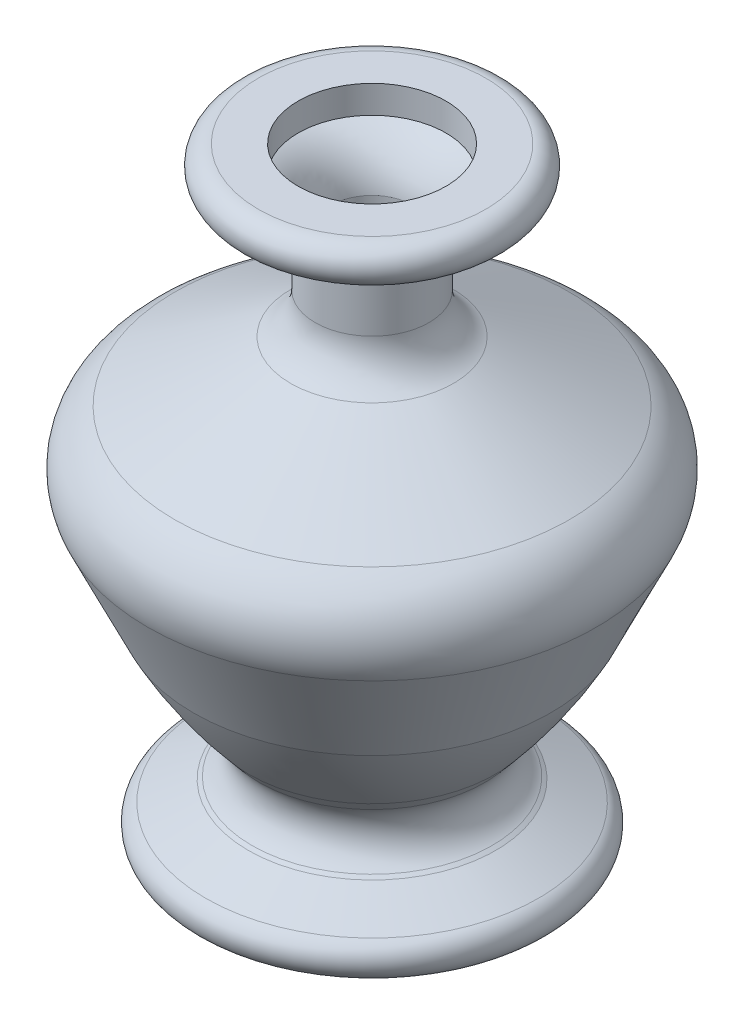
ISO-10303-21;
HEADER;
FILE_DESCRIPTION(('STEP AP214'),'2;1');
FILE_NAME('part.step','',(''),(''),'','','');
FILE_SCHEMA(('AUTOMOTIVE_DESIGN { 1 0 10303 214 1 1 1 1 }'));
ENDSEC;
DATA;
#1=APPLICATION_CONTEXT('core data for automotive mechanical design processes');
#2=APPLICATION_PROTOCOL_DEFINITION('international standard','automotive_design',2000,#1);
#3=PRODUCT_CONTEXT('',#1,'mechanical');
#4=PRODUCT('Part','Part','',(#3));
#5=PRODUCT_RELATED_PRODUCT_CATEGORY('part','',(#4));
#6=PRODUCT_DEFINITION_FORMATION('','',#4);
#7=PRODUCT_DEFINITION_CONTEXT('part definition',#1,'design');
#8=PRODUCT_DEFINITION('design','',#6,#7);
#9=PRODUCT_DEFINITION_SHAPE('','',#8);
#10=(LENGTH_UNIT() NAMED_UNIT(*) SI_UNIT(.MILLI.,.METRE.));
#11=(NAMED_UNIT(*) PLANE_ANGLE_UNIT() SI_UNIT($,.RADIAN.));
#12=(NAMED_UNIT(*) SI_UNIT($,.STERADIAN.) SOLID_ANGLE_UNIT());
#13=UNCERTAINTY_MEASURE_WITH_UNIT(LENGTH_MEASURE(1.E-05),#10,'distance_accuracy_value','');
#14=(GEOMETRIC_REPRESENTATION_CONTEXT(3) GLOBAL_UNCERTAINTY_ASSIGNED_CONTEXT((#13)) GLOBAL_UNIT_ASSIGNED_CONTEXT((#10,
#11,#12)) REPRESENTATION_CONTEXT('',''));
#15=CARTESIAN_POINT('',(0.,0.,0.));
#16=DIRECTION('',(0.,0.,1.));
#17=DIRECTION('',(1.,0.,0.));
#18=AXIS2_PLACEMENT_3D('',#15,#16,#17);
#19=CARTESIAN_POINT('',(-60.0765679059718,144.763199741375,0.));
#20=DIRECTION('',(0.,1.,0.));
#21=DIRECTION('',(0.,0.,1.));
#22=AXIS2_PLACEMENT_3D('',#19,#20,#21);
#23=TOROIDAL_SURFACE('',#22,26.7773438942599,12.);
#24=CARTESIAN_POINT('',(-60.0765679059718,156.763199741375,0.));
#25=DIRECTION('',(0.,1.,0.));
#26=DIRECTION('',(0.,0.,1.));
#27=AXIS2_PLACEMENT_3D('',#24,#25,#26);
#28=CIRCLE('',#27,26.7773438942599);
#29=CARTESIAN_POINT('',(-60.0765679059718,156.763199741375,26.7773438942599));
#30=VERTEX_POINT('',#29);
#31=EDGE_CURVE('E126',#30,#30,#28,.T.);
#32=ORIENTED_EDGE('',*,*,#31,.F.);
#33=EDGE_LOOP('',(#32));
#34=FACE_BOUND('',#33,.T.);
#35=CARTESIAN_POINT('',(-60.0765679059718,147.064106257585,0.));
#36=DIRECTION('',(0.,1.,0.));
#37=DIRECTION('',(0.,0.,1.));
#38=AXIS2_PLACEMENT_3D('',#35,#36,#37);
#39=CIRCLE('',#38,15.);
#40=CARTESIAN_POINT('',(-60.0765679059718,147.064106257585,15.));
#41=VERTEX_POINT('',#40);
#42=EDGE_CURVE('E10',#41,#41,#39,.T.);
#43=ORIENTED_EDGE('',*,*,#42,.T.);
#44=EDGE_LOOP('',(#43));
#45=FACE_BOUND('',#44,.T.);
#46=ADVANCED_FACE('F35',(#34,#45),#23,.F.);
#47=CARTESIAN_POINT('',(-60.0765679059718,168.729058273268,0.));
#48=DIRECTION('',(0.,1.,0.));
#49=DIRECTION('',(0.,0.,1.));
#50=AXIS2_PLACEMENT_3D('',#47,#48,#49);
#51=CYLINDRICAL_SURFACE('',#50,15.);
#52=CARTESIAN_POINT('',(-60.0765679059718,133.364106257585,0.));
#53=DIRECTION('',(0.,1.,0.));
#54=DIRECTION('',(0.,0.,1.));
#55=AXIS2_PLACEMENT_3D('',#52,#53,#54);
#56=CIRCLE('',#55,15.);
#57=CARTESIAN_POINT('',(-60.0765679059718,133.364106257585,15.));
#58=VERTEX_POINT('',#57);
#59=EDGE_CURVE('E41',#58,#58,#56,.T.);
#60=ORIENTED_EDGE('',*,*,#59,.T.);
#61=EDGE_LOOP('',(#60));
#62=FACE_BOUND('',#61,.T.);
#63=ORIENTED_EDGE('',*,*,#42,.F.);
#64=EDGE_LOOP('',(#63));
#65=FACE_BOUND('',#64,.T.);
#66=ADVANCED_FACE('F133',(#62,#65),#51,.T.);
#67=CARTESIAN_POINT('',(-60.0765679059718,133.364106257585,0.));
#68=DIRECTION('',(0.,1.,0.));
#69=DIRECTION('',(0.,0.,1.));
#70=AXIS2_PLACEMENT_3D('',#67,#68,#69);
#71=TOROIDAL_SURFACE('',#70,27.,12.0000000000001);
#72=CARTESIAN_POINT('',(-60.0765679059718,122.711419863062,0.));
#73=DIRECTION('',(0.,1.,0.));
#74=DIRECTION('',(0.,0.,1.));
#75=AXIS2_PLACEMENT_3D('',#72,#73,#74);
#76=CIRCLE('',#75,21.475484403139);
#77=CARTESIAN_POINT('',(-60.0765679059718,122.711419863062,21.475484403139));
#78=VERTEX_POINT('',#77);
#79=EDGE_CURVE('E45',#78,#78,#76,.T.);
#80=ORIENTED_EDGE('',*,*,#79,.T.);
#81=EDGE_LOOP('',(#80));
#82=FACE_BOUND('',#81,.T.);
#83=ORIENTED_EDGE('',*,*,#59,.F.);
#84=EDGE_LOOP('',(#83));
#85=FACE_BOUND('',#84,.T.);
#86=ADVANCED_FACE('F137',(#82,#85),#71,.F.);
#87=CARTESIAN_POINT('',(-60.0765679059718,122.711419863062,0.));
#88=DIRECTION('',(0.,-1.,0.));
#89=DIRECTION('',(0.,0.,-1.));
#90=AXIS2_PLACEMENT_3D('',#87,#88,#89);
#91=CONICAL_SURFACE('',#90,21.475484403139,1.09237728206462);
#92=CARTESIAN_POINT('',(-60.0765679059718,106.855347916404,0.));
#93=DIRECTION('',(0.,1.,0.));
#94=DIRECTION('',(0.,0.,1.));
#95=AXIS2_PLACEMENT_3D('',#92,#93,#94);
#96=CIRCLE('',#95,52.0500676286264);
#97=CARTESIAN_POINT('',(-60.0765679059718,106.855347916404,52.0500676286264));
#98=VERTEX_POINT('',#97);
#99=EDGE_CURVE('E49',#98,#98,#96,.T.);
#100=ORIENTED_EDGE('',*,*,#99,.T.);
#101=EDGE_LOOP('',(#100));
#102=FACE_BOUND('',#101,.T.);
#103=ORIENTED_EDGE('',*,*,#79,.F.);
#104=EDGE_LOOP('',(#103));
#105=FACE_BOUND('',#104,.T.);
#106=ADVANCED_FACE('F141',(#102,#105),#91,.T.);
#107=CARTESIAN_POINT('',(-60.0765679059718,92.6517660570412,0.));
#108=DIRECTION('',(0.,1.,0.));
#109=DIRECTION('',(0.,0.,1.));
#110=AXIS2_PLACEMENT_3D('',#107,#108,#109);
#111=TOROIDAL_SURFACE('',#110,44.6840468328117,16.);
#112=ORIENTED_EDGE('',*,*,#99,.F.);
#113=EDGE_LOOP('',(#112));
#114=FACE_BOUND('',#113,.T.);
#115=CARTESIAN_POINT('',(-60.0765679059718,85.8324017523891,0.));
#116=DIRECTION('',(0.,1.,0.));
#117=DIRECTION('',(0.,0.,1.));
#118=AXIS2_PLACEMENT_3D('',#115,#116,#117);
#119=CIRCLE('',#118,59.1580328242529);
#120=CARTESIAN_POINT('',(-60.0765679059718,85.8324017523891,59.1580328242529));
#121=VERTEX_POINT('',#120);
#122=EDGE_CURVE('E54',#121,#121,#119,.T.);
#123=ORIENTED_EDGE('',*,*,#122,.T.);
#124=EDGE_LOOP('',(#123));
#125=FACE_BOUND('',#124,.T.);
#126=ADVANCED_FACE('F148',(#114,#125),#111,.T.);
#127=CARTESIAN_POINT('',(-60.0765679059718,60.2250987462849,0.));
#128=DIRECTION('',(0.,1.,0.));
#129=DIRECTION('',(0.,0.,1.));
#130=AXIS2_PLACEMENT_3D('',#127,#128,#129);
#131=CONICAL_SURFACE('',#130,47.0932478948286,0.440299334140072);
#132=ORIENTED_EDGE('',*,*,#122,.F.);
#133=EDGE_LOOP('',(#132));
#134=FACE_BOUND('',#133,.T.);
#135=CARTESIAN_POINT('',(-60.0765679059718,60.2250987462849,0.));
#136=DIRECTION('',(0.,1.,0.));
#137=DIRECTION('',(0.,0.,1.));
#138=AXIS2_PLACEMENT_3D('',#135,#136,#137);
#139=CIRCLE('',#138,47.0932478948286);
#140=CARTESIAN_POINT('',(-60.0765679059718,60.2250987462849,47.0932478948286));
#141=VERTEX_POINT('',#140);
#142=EDGE_CURVE('E57',#141,#141,#139,.T.);
#143=ORIENTED_EDGE('',*,*,#142,.T.);
#144=EDGE_LOOP('',(#143));
#145=FACE_BOUND('',#144,.T.);
#146=ADVANCED_FACE('F152',(#134,#145),#131,.T.);
#147=CARTESIAN_POINT('',(-60.0765679059718,119.686273789408,0.));
#148=DIRECTION('',(0.,1.,0.));
#149=DIRECTION('',(0.,0.,1.));
#150=AXIS2_PLACEMENT_3D('',#147,#148,#149);
#151=DEGENERATE_TOROIDAL_SURFACE('',#150,62.6309912799823,124.8,.F.);
#152=CARTESIAN_POINT('',(-60.0765679059718,38.9100400277715,0.));
#153=DIRECTION('',(0.,1.,0.));
#154=DIRECTION('',(0.,0.,1.));
#155=AXIS2_PLACEMENT_3D('',#152,#153,#154);
#156=CIRCLE('',#155,32.5017583874457);
#157=CARTESIAN_POINT('',(-60.0765679059718,38.9100400277715,32.5017583874457));
#158=VERTEX_POINT('',#157);
#159=EDGE_CURVE('E60',#158,#158,#156,.T.);
#160=ORIENTED_EDGE('',*,*,#159,.T.);
#161=EDGE_LOOP('',(#160));
#162=FACE_BOUND('',#161,.T.);
#163=ORIENTED_EDGE('',*,*,#142,.F.);
#164=EDGE_LOOP('',(#163));
#165=FACE_BOUND('',#164,.T.);
#166=ADVANCED_FACE('F156',(#162,#165),#151,.F.);
#167=CARTESIAN_POINT('',(-60.0765679059718,38.9100400277715,0.));
#168=DIRECTION('',(0.,1.,0.));
#169=DIRECTION('',(0.,0.,1.));
#170=AXIS2_PLACEMENT_3D('',#167,#168,#169);
#171=CONICAL_SURFACE('',#170,32.5017583874457,0.703965325612332);
#172=CARTESIAN_POINT('',(-60.0765679059718,35.6021515100554,0.));
#173=DIRECTION('',(0.,1.,0.));
#174=DIRECTION('',(0.,0.,1.));
#175=AXIS2_PLACEMENT_3D('',#172,#173,#174);
#176=CIRCLE('',#175,29.6930644613418);
#177=CARTESIAN_POINT('',(-60.0765679059718,35.6021515100554,29.6930644613418));
#178=VERTEX_POINT('',#177);
#179=EDGE_CURVE('E63',#178,#178,#176,.T.);
#180=ORIENTED_EDGE('',*,*,#179,.T.);
#181=EDGE_LOOP('',(#180));
#182=FACE_BOUND('',#181,.T.);
#183=ORIENTED_EDGE('',*,*,#159,.F.);
#184=EDGE_LOOP('',(#183));
#185=FACE_BOUND('',#184,.T.);
#186=ADVANCED_FACE('F160',(#182,#185),#171,.T.);
#187=CARTESIAN_POINT('',(-60.0765679059718,29.7769423445542,0.));
#188=DIRECTION('',(0.,1.,0.));
#189=DIRECTION('',(0.,0.,1.));
#190=AXIS2_PLACEMENT_3D('',#187,#188,#189);
#191=TOROIDAL_SURFACE('',#190,36.5535992931258,8.99999999999777);
#192=CARTESIAN_POINT('',(-60.0765679059718,22.2185457265492,0.));
#193=DIRECTION('',(0.,1.,0.));
#194=DIRECTION('',(0.,0.,1.));
#195=AXIS2_PLACEMENT_3D('',#192,#193,#194);
#196=CIRCLE('',#195,31.6678403382764);
#197=CARTESIAN_POINT('',(-60.0765679059718,22.2185457265492,31.6678403382764));
#198=VERTEX_POINT('',#197);
#199=EDGE_CURVE('E66',#198,#198,#196,.T.);
#200=ORIENTED_EDGE('',*,*,#199,.T.);
#201=EDGE_LOOP('',(#200));
#202=FACE_BOUND('',#201,.T.);
#203=ORIENTED_EDGE('',*,*,#179,.F.);
#204=EDGE_LOOP('',(#203));
#205=FACE_BOUND('',#204,.T.);
#206=ADVANCED_FACE('F164',(#202,#205),#191,.F.);
#207=CARTESIAN_POINT('',(-60.0765679059718,22.2185457265492,0.));
#208=DIRECTION('',(0.,-1.,0.));
#209=DIRECTION('',(0.,0.,-1.));
#210=AXIS2_PLACEMENT_3D('',#207,#208,#209);
#211=CONICAL_SURFACE('',#210,31.6678403382764,0.996954964416852);
#212=CARTESIAN_POINT('',(-60.0765679059718,21.5894611194127,0.));
#213=DIRECTION('',(0.,1.,0.));
#214=DIRECTION('',(0.,0.,1.));
#215=AXIS2_PLACEMENT_3D('',#212,#213,#214);
#216=CIRCLE('',#215,32.6410506441799);
#217=CARTESIAN_POINT('',(-60.0765679059718,21.5894611194127,32.6410506441799));
#218=VERTEX_POINT('',#217);
#219=EDGE_CURVE('E69',#218,#218,#216,.T.);
#220=ORIENTED_EDGE('',*,*,#219,.T.);
#221=EDGE_LOOP('',(#220));
#222=FACE_BOUND('',#221,.T.);
#223=ORIENTED_EDGE('',*,*,#199,.F.);
#224=EDGE_LOOP('',(#223));
#225=FACE_BOUND('',#224,.T.);
#226=ADVANCED_FACE('F168',(#222,#225),#211,.T.);
#227=CARTESIAN_POINT('',(-60.0765679059718,16.2863203636992,0.));
#228=DIRECTION('',(0.,-1.,0.));
#229=DIRECTION('',(0.,0.,-1.));
#230=AXIS2_PLACEMENT_3D('',#227,#228,#229);
#231=CONICAL_SURFACE('',#230,43.8968776655454,1.13049699265483);
#232=ORIENTED_EDGE('',*,*,#219,.F.);
#233=EDGE_LOOP('',(#232));
#234=FACE_BOUND('',#233,.T.);
#235=CARTESIAN_POINT('',(-60.0765679059718,16.2863203636992,0.));
#236=DIRECTION('',(0.,1.,0.));
#237=DIRECTION('',(0.,0.,1.));
#238=AXIS2_PLACEMENT_3D('',#235,#236,#237);
#239=CIRCLE('',#238,43.8968776655454);
#240=CARTESIAN_POINT('',(-60.0765679059718,16.2863203636992,43.8968776655454));
#241=VERTEX_POINT('',#240);
#242=EDGE_CURVE('E72',#241,#241,#239,.T.);
#243=ORIENTED_EDGE('',*,*,#242,.T.);
#244=EDGE_LOOP('',(#243));
#245=FACE_BOUND('',#244,.T.);
#246=ADVANCED_FACE('F172',(#234,#245),#231,.T.);
#247=CARTESIAN_POINT('',(-60.0765679059718,11.763199741374,0.));
#248=DIRECTION('',(0.,1.,0.));
#249=DIRECTION('',(0.,0.,1.));
#250=AXIS2_PLACEMENT_3D('',#247,#248,#249);
#251=TOROIDAL_SURFACE('',#250,41.7658263203418,4.99999999999973);
#252=ORIENTED_EDGE('',*,*,#242,.F.);
#253=EDGE_LOOP('',(#252));
#254=FACE_BOUND('',#253,.T.);
#255=CARTESIAN_POINT('',(-60.0765679059718,6.76319974137432,0.));
#256=DIRECTION('',(0.,1.,0.));
#257=DIRECTION('',(0.,0.,1.));
#258=AXIS2_PLACEMENT_3D('',#255,#256,#257);
#259=CIRCLE('',#258,41.7658263203418);
#260=CARTESIAN_POINT('',(-60.0765679059718,6.76319974137432,41.7658263203418));
#261=VERTEX_POINT('',#260);
#262=EDGE_CURVE('E75',#261,#261,#259,.T.);
#263=ORIENTED_EDGE('',*,*,#262,.T.);
#264=EDGE_LOOP('',(#263));
#265=FACE_BOUND('',#264,.T.);
#266=ADVANCED_FACE('F176',(#254,#265),#251,.T.);
#267=CARTESIAN_POINT('',(0.,6.76319974137431,0.));
#268=DIRECTION('',(0.,1.,0.));
#269=DIRECTION('',(0.,0.,1.));
#270=AXIS2_PLACEMENT_3D('',#267,#268,#269);
#271=PLANE('',#270);
#272=ORIENTED_EDGE('',*,*,#262,.F.);
#273=EDGE_LOOP('',(#272));
#274=FACE_BOUND('',#273,.T.);
#275=ADVANCED_FACE('F180',(#274),#271,.F.);
#276=CARTESIAN_POINT('',(0.,11.1631997413743,0.));
#277=DIRECTION('',(0.,-1.,0.));
#278=DIRECTION('',(0.,0.,-1.));
#279=AXIS2_PLACEMENT_3D('',#276,#277,#278);
#280=PLANE('',#279);
#281=CARTESIAN_POINT('',(-60.0765679059718,11.1631997413743,0.));
#282=DIRECTION('',(0.,1.,0.));
#283=DIRECTION('',(0.,0.,1.));
#284=AXIS2_PLACEMENT_3D('',#281,#282,#283);
#285=CIRCLE('',#284,41.7658263203418);
#286=CARTESIAN_POINT('',(-60.0765679059718,11.1631997413743,41.7658263203418));
#287=VERTEX_POINT('',#286);
#288=EDGE_CURVE('E78',#287,#287,#285,.T.);
#289=ORIENTED_EDGE('',*,*,#288,.T.);
#290=EDGE_LOOP('',(#289));
#291=FACE_BOUND('',#290,.T.);
#292=ADVANCED_FACE('F184',(#291),#280,.F.);
#293=CARTESIAN_POINT('',(-60.0765679059718,11.763199741374,0.));
#294=DIRECTION('',(0.,1.,0.));
#295=DIRECTION('',(0.,0.,1.));
#296=AXIS2_PLACEMENT_3D('',#293,#294,#295);
#297=TOROIDAL_SURFACE('',#296,41.7658263203418,0.599999999999732);
#298=CARTESIAN_POINT('',(-60.0765679059718,12.3059742160528,0.));
#299=DIRECTION('',(0.,1.,0.));
#300=DIRECTION('',(0.,0.,1.));
#301=AXIS2_PLACEMENT_3D('',#298,#299,#300);
#302=CIRCLE('',#301,42.0215524817661);
#303=CARTESIAN_POINT('',(-60.0765679059718,12.3059742160528,42.0215524817661));
#304=VERTEX_POINT('',#303);
#305=EDGE_CURVE('E81',#304,#304,#302,.T.);
#306=ORIENTED_EDGE('',*,*,#305,.T.);
#307=EDGE_LOOP('',(#306));
#308=FACE_BOUND('',#307,.T.);
#309=ORIENTED_EDGE('',*,*,#288,.F.);
#310=EDGE_LOOP('',(#309));
#311=FACE_BOUND('',#310,.T.);
#312=ADVANCED_FACE('F188',(#308,#311),#297,.F.);
#313=CARTESIAN_POINT('',(-60.0765679059718,12.3059742160528,0.));
#314=DIRECTION('',(0.,-1.,0.));
#315=DIRECTION('',(0.,0.,-1.));
#316=AXIS2_PLACEMENT_3D('',#313,#314,#315);
#317=CONICAL_SURFACE('',#316,42.0215524817661,1.13049699265482);
#318=CARTESIAN_POINT('',(-60.0765679059718,17.7345187569274,0.));
#319=DIRECTION('',(0.,1.,0.));
#320=DIRECTION('',(0.,0.,1.));
#321=AXIS2_PLACEMENT_3D('',#318,#319,#320);
#322=CIRCLE('',#321,30.4995580364875);
#323=CARTESIAN_POINT('',(-60.0765679059718,17.7345187569274,30.4995580364875));
#324=VERTEX_POINT('',#323);
#325=EDGE_CURVE('E84',#324,#324,#322,.T.);
#326=ORIENTED_EDGE('',*,*,#325,.T.);
#327=EDGE_LOOP('',(#326));
#328=FACE_BOUND('',#327,.T.);
#329=ORIENTED_EDGE('',*,*,#305,.F.);
#330=EDGE_LOOP('',(#329));
#331=FACE_BOUND('',#330,.T.);
#332=ADVANCED_FACE('F192',(#328,#331),#317,.F.);
#333=CARTESIAN_POINT('',(-60.0765679059718,18.5233296021903,0.));
#334=DIRECTION('',(0.,-1.,0.));
#335=DIRECTION('',(0.,0.,-1.));
#336=AXIS2_PLACEMENT_3D('',#333,#334,#335);
#337=CONICAL_SURFACE('',#336,29.2792470714607,0.996954964416839);
#338=ORIENTED_EDGE('',*,*,#325,.F.);
#339=EDGE_LOOP('',(#338));
#340=FACE_BOUND('',#339,.T.);
#341=CARTESIAN_POINT('',(-60.0765679059718,18.5233296021903,0.));
#342=DIRECTION('',(0.,1.,0.));
#343=DIRECTION('',(0.,0.,1.));
#344=AXIS2_PLACEMENT_3D('',#341,#342,#343);
#345=CIRCLE('',#344,29.2792470714607);
#346=CARTESIAN_POINT('',(-60.0765679059718,18.5233296021903,29.2792470714607));
#347=VERTEX_POINT('',#346);
#348=EDGE_CURVE('E87',#347,#347,#345,.T.);
#349=ORIENTED_EDGE('',*,*,#348,.T.);
#350=EDGE_LOOP('',(#349));
#351=FACE_BOUND('',#350,.T.);
#352=ADVANCED_FACE('F196',(#340,#351),#337,.F.);
#353=CARTESIAN_POINT('',(-60.0765679059718,29.7769423445542,0.));
#354=DIRECTION('',(0.,1.,0.));
#355=DIRECTION('',(0.,0.,1.));
#356=AXIS2_PLACEMENT_3D('',#353,#354,#355);
#357=TOROIDAL_SURFACE('',#356,36.5535992931258,13.3999999999978);
#358=ORIENTED_EDGE('',*,*,#348,.F.);
#359=EDGE_LOOP('',(#358));
#360=FACE_BOUND('',#359,.T.);
#361=CARTESIAN_POINT('',(-60.0765679059718,38.4500315465233,0.));
#362=DIRECTION('',(0.,1.,0.));
#363=DIRECTION('',(0.,0.,1.));
#364=AXIS2_PLACEMENT_3D('',#361,#362,#363);
#365=CIRCLE('',#364,26.3390252102466);
#366=CARTESIAN_POINT('',(-60.0765679059718,38.4500315465233,26.3390252102466));
#367=VERTEX_POINT('',#366);
#368=EDGE_CURVE('E90',#367,#367,#365,.T.);
#369=ORIENTED_EDGE('',*,*,#368,.T.);
#370=EDGE_LOOP('',(#369));
#371=FACE_BOUND('',#370,.T.);
#372=ADVANCED_FACE('F200',(#360,#371),#357,.T.);
#373=CARTESIAN_POINT('',(-60.0765679059718,41.7579200642392,0.));
#374=DIRECTION('',(0.,1.,0.));
#375=DIRECTION('',(0.,0.,1.));
#376=AXIS2_PLACEMENT_3D('',#373,#374,#375);
#377=CONICAL_SURFACE('',#376,29.1477191363503,0.703965325612332);
#378=ORIENTED_EDGE('',*,*,#368,.F.);
#379=EDGE_LOOP('',(#378));
#380=FACE_BOUND('',#379,.T.);
#381=CARTESIAN_POINT('',(-60.0765679059718,41.7579200642392,0.));
#382=DIRECTION('',(0.,1.,0.));
#383=DIRECTION('',(0.,0.,1.));
#384=AXIS2_PLACEMENT_3D('',#381,#382,#383);
#385=CIRCLE('',#384,29.1477191363503);
#386=CARTESIAN_POINT('',(-60.0765679059718,41.7579200642392,29.1477191363503));
#387=VERTEX_POINT('',#386);
#388=EDGE_CURVE('E93',#387,#387,#385,.T.);
#389=ORIENTED_EDGE('',*,*,#388,.T.);
#390=EDGE_LOOP('',(#389));
#391=FACE_BOUND('',#390,.T.);
#392=ADVANCED_FACE('F204',(#380,#391),#377,.F.);
#393=CARTESIAN_POINT('',(-60.0765679059718,119.686273789408,0.));
#394=DIRECTION('',(0.,1.,0.));
#395=DIRECTION('',(0.,0.,1.));
#396=AXIS2_PLACEMENT_3D('',#393,#394,#395);
#397=DEGENERATE_TOROIDAL_SURFACE('',#396,62.6309912799823,120.4,.F.);
#398=ORIENTED_EDGE('',*,*,#388,.F.);
#399=EDGE_LOOP('',(#398));
#400=FACE_BOUND('',#399,.T.);
#401=CARTESIAN_POINT('',(-60.0765679059718,62.2135371887155,0.));
#402=DIRECTION('',(0.,1.,0.));
#403=DIRECTION('',(0.,0.,1.));
#404=AXIS2_PLACEMENT_3D('',#401,#402,#403);
#405=CIRCLE('',#404,43.1661946354638);
#406=CARTESIAN_POINT('',(-60.0765679059718,62.2135371887155,43.1661946354638));
#407=VERTEX_POINT('',#406);
#408=EDGE_CURVE('E96',#407,#407,#405,.T.);
#409=ORIENTED_EDGE('',*,*,#408,.T.);
#410=EDGE_LOOP('',(#409));
#411=FACE_BOUND('',#410,.T.);
#412=ADVANCED_FACE('F208',(#400,#411),#397,.T.);
#413=CARTESIAN_POINT('',(-60.0765679059718,62.2135371887155,0.));
#414=DIRECTION('',(0.,1.,0.));
#415=DIRECTION('',(0.,0.,1.));
#416=AXIS2_PLACEMENT_3D('',#413,#414,#415);
#417=CONICAL_SURFACE('',#416,43.1661946354638,0.440299334140071);
#418=CARTESIAN_POINT('',(-60.0765679059718,87.7077269361683,0.));
#419=DIRECTION('',(0.,1.,0.));
#420=DIRECTION('',(0.,0.,1.));
#421=AXIS2_PLACEMENT_3D('',#418,#419,#420);
#422=CIRCLE('',#421,55.1776866766066);
#423=CARTESIAN_POINT('',(-60.0765679059718,87.7077269361683,55.1776866766066));
#424=VERTEX_POINT('',#423);
#425=EDGE_CURVE('E99',#424,#424,#422,.T.);
#426=ORIENTED_EDGE('',*,*,#425,.T.);
#427=EDGE_LOOP('',(#426));
#428=FACE_BOUND('',#427,.T.);
#429=ORIENTED_EDGE('',*,*,#408,.F.);
#430=EDGE_LOOP('',(#429));
#431=FACE_BOUND('',#430,.T.);
#432=ADVANCED_FACE('F212',(#428,#431),#417,.F.);
#433=CARTESIAN_POINT('',(-60.0765679059718,92.6517660570412,0.));
#434=DIRECTION('',(0.,1.,0.));
#435=DIRECTION('',(0.,0.,1.));
#436=AXIS2_PLACEMENT_3D('',#433,#434,#435);
#437=TOROIDAL_SURFACE('',#436,44.6840468328117,11.6);
#438=CARTESIAN_POINT('',(-60.0765679059718,102.949362905079,0.));
#439=DIRECTION('',(0.,1.,0.));
#440=DIRECTION('',(0.,0.,1.));
#441=AXIS2_PLACEMENT_3D('',#438,#439,#440);
#442=CIRCLE('',#441,50.0244119097773);
#443=CARTESIAN_POINT('',(-60.0765679059718,102.949362905079,50.0244119097773));
#444=VERTEX_POINT('',#443);
#445=EDGE_CURVE('E102',#444,#444,#442,.T.);
#446=ORIENTED_EDGE('',*,*,#445,.T.);
#447=EDGE_LOOP('',(#446));
#448=FACE_BOUND('',#447,.T.);
#449=ORIENTED_EDGE('',*,*,#425,.F.);
#450=EDGE_LOOP('',(#449));
#451=FACE_BOUND('',#450,.T.);
#452=ADVANCED_FACE('F216',(#448,#451),#437,.F.);
#453=CARTESIAN_POINT('',(-60.0765679059718,118.805434851737,0.));
#454=DIRECTION('',(0.,-1.,0.));
#455=DIRECTION('',(0.,0.,-1.));
#456=AXIS2_PLACEMENT_3D('',#453,#454,#455);
#457=CONICAL_SURFACE('',#456,19.44982868429,1.09237728206462);
#458=ORIENTED_EDGE('',*,*,#445,.F.);
#459=EDGE_LOOP('',(#458));
#460=FACE_BOUND('',#459,.T.);
#461=CARTESIAN_POINT('',(-60.0765679059718,118.805434851737,0.));
#462=DIRECTION('',(0.,1.,0.));
#463=DIRECTION('',(0.,0.,1.));
#464=AXIS2_PLACEMENT_3D('',#461,#462,#463);
#465=CIRCLE('',#464,19.44982868429);
#466=CARTESIAN_POINT('',(-60.0765679059718,118.805434851737,19.44982868429));
#467=VERTEX_POINT('',#466);
#468=EDGE_CURVE('E105',#467,#467,#465,.T.);
#469=ORIENTED_EDGE('',*,*,#468,.T.);
#470=EDGE_LOOP('',(#469));
#471=FACE_BOUND('',#470,.T.);
#472=ADVANCED_FACE('F220',(#460,#471),#457,.F.);
#473=CARTESIAN_POINT('',(-60.0765679059718,133.364106257585,0.));
#474=DIRECTION('',(0.,1.,0.));
#475=DIRECTION('',(0.,0.,1.));
#476=AXIS2_PLACEMENT_3D('',#473,#474,#475);
#477=TOROIDAL_SURFACE('',#476,27.,16.4000000000002);
#478=ORIENTED_EDGE('',*,*,#468,.F.);
#479=EDGE_LOOP('',(#478));
#480=FACE_BOUND('',#479,.T.);
#481=CARTESIAN_POINT('',(-60.0765679059718,133.364106257585,0.));
#482=DIRECTION('',(0.,1.,0.));
#483=DIRECTION('',(0.,0.,1.));
#484=AXIS2_PLACEMENT_3D('',#481,#482,#483);
#485=CIRCLE('',#484,10.5999999999999);
#486=CARTESIAN_POINT('',(-60.0765679059718,133.364106257585,10.5999999999999));
#487=VERTEX_POINT('',#486);
#488=EDGE_CURVE('E108',#487,#487,#485,.T.);
#489=ORIENTED_EDGE('',*,*,#488,.T.);
#490=EDGE_LOOP('',(#489));
#491=FACE_BOUND('',#490,.T.);
#492=ADVANCED_FACE('F224',(#480,#491),#477,.T.);
#493=CARTESIAN_POINT('',(-60.0765679059718,168.729058273268,0.));
#494=DIRECTION('',(0.,1.,0.));
#495=DIRECTION('',(0.,0.,1.));
#496=AXIS2_PLACEMENT_3D('',#493,#494,#495);
#497=CYLINDRICAL_SURFACE('',#496,10.6);
#498=ORIENTED_EDGE('',*,*,#488,.F.);
#499=EDGE_LOOP('',(#498));
#500=FACE_BOUND('',#499,.T.);
#501=CARTESIAN_POINT('',(-60.0765679059718,147.456440266625,0.));
#502=DIRECTION('',(0.,1.,0.));
#503=DIRECTION('',(0.,0.,1.));
#504=AXIS2_PLACEMENT_3D('',#501,#502,#503);
#505=CIRCLE('',#504,10.6);
#506=CARTESIAN_POINT('',(-60.0765679059718,147.456440266625,10.6));
#507=VERTEX_POINT('',#506);
#508=EDGE_CURVE('E111',#507,#507,#505,.T.);
#509=ORIENTED_EDGE('',*,*,#508,.T.);
#510=EDGE_LOOP('',(#509));
#511=FACE_BOUND('',#510,.T.);
#512=ADVANCED_FACE('F228',(#500,#511),#497,.F.);
#513=CARTESIAN_POINT('',(-60.0765679059718,144.763199741375,0.));
#514=DIRECTION('',(0.,1.,0.));
#515=DIRECTION('',(0.,0.,1.));
#516=AXIS2_PLACEMENT_3D('',#513,#514,#515);
#517=TOROIDAL_SURFACE('',#516,26.7773438942599,16.4);
#518=CARTESIAN_POINT('',(-60.0765679059718,159.46014724229,0.));
#519=DIRECTION('',(0.,1.,0.));
#520=DIRECTION('',(0.,0.,1.));
#521=AXIS2_PLACEMENT_3D('',#518,#519,#520);
#522=CIRCLE('',#521,19.5);
#523=CARTESIAN_POINT('',(-60.0765679059718,159.46014724229,19.5));
#524=VERTEX_POINT('',#523);
#525=EDGE_CURVE('E114',#524,#524,#522,.T.);
#526=ORIENTED_EDGE('',*,*,#525,.T.);
#527=EDGE_LOOP('',(#526));
#528=FACE_BOUND('',#527,.T.);
#529=ORIENTED_EDGE('',*,*,#508,.F.);
#530=EDGE_LOOP('',(#529));
#531=FACE_BOUND('',#530,.T.);
#532=ADVANCED_FACE('F232',(#528,#531),#517,.T.);
#533=CARTESIAN_POINT('',(-60.0765679059718,168.729058273268,0.));
#534=DIRECTION('',(0.,1.,0.));
#535=DIRECTION('',(0.,0.,1.));
#536=AXIS2_PLACEMENT_3D('',#533,#534,#535);
#537=CYLINDRICAL_SURFACE('',#536,19.5);
#538=CARTESIAN_POINT('',(-60.0765679059718,166.763199741375,0.));
#539=DIRECTION('',(0.,1.,0.));
#540=DIRECTION('',(0.,0.,1.));
#541=AXIS2_PLACEMENT_3D('',#538,#539,#540);
#542=CIRCLE('',#541,19.5);
#543=CARTESIAN_POINT('',(-60.0765679059718,166.763199741375,19.5));
#544=VERTEX_POINT('',#543);
#545=EDGE_CURVE('E117',#544,#544,#542,.T.);
#546=ORIENTED_EDGE('',*,*,#545,.T.);
#547=EDGE_LOOP('',(#546));
#548=FACE_BOUND('',#547,.T.);
#549=ORIENTED_EDGE('',*,*,#525,.F.);
#550=EDGE_LOOP('',(#549));
#551=FACE_BOUND('',#550,.T.);
#552=ADVANCED_FACE('F236',(#548,#551),#537,.F.);
#553=CARTESIAN_POINT('',(-4.4081986669771E-13,166.763199741374,0.));
#554=DIRECTION('',(0.,-1.,0.));
#555=DIRECTION('',(0.,0.,-1.));
#556=AXIS2_PLACEMENT_3D('',#553,#554,#555);
#557=PLANE('',#556);
#558=ORIENTED_EDGE('',*,*,#545,.F.);
#559=EDGE_LOOP('',(#558));
#560=FACE_BOUND('',#559,.T.);
#561=CARTESIAN_POINT('',(-60.0765679059718,166.763199741374,0.));
#562=DIRECTION('',(0.,1.,0.));
#563=DIRECTION('',(0.,0.,1.));
#564=AXIS2_PLACEMENT_3D('',#561,#562,#563);
#565=CIRCLE('',#564,30.);
#566=CARTESIAN_POINT('',(-60.0765679059718,166.763199741374,30.));
#567=VERTEX_POINT('',#566);
#568=EDGE_CURVE('E120',#567,#567,#565,.T.);
#569=ORIENTED_EDGE('',*,*,#568,.T.);
#570=EDGE_LOOP('',(#569));
#571=FACE_BOUND('',#570,.T.);
#572=ADVANCED_FACE('F240',(#560,#571),#557,.F.);
#573=CARTESIAN_POINT('',(-60.0765679059718,161.763199741375,0.));
#574=DIRECTION('',(0.,1.,0.));
#575=DIRECTION('',(0.,0.,1.));
#576=AXIS2_PLACEMENT_3D('',#573,#574,#575);
#577=TOROIDAL_SURFACE('',#576,30.,4.99999999999995);
#578=CARTESIAN_POINT('',(-60.0765679059718,156.763199741375,0.));
#579=DIRECTION('',(0.,1.,0.));
#580=DIRECTION('',(0.,0.,1.));
#581=AXIS2_PLACEMENT_3D('',#578,#579,#580);
#582=CIRCLE('',#581,30.);
#583=CARTESIAN_POINT('',(-60.0765679059718,156.763199741375,30.));
#584=VERTEX_POINT('',#583);
#585=EDGE_CURVE('E123',#584,#584,#582,.T.);
#586=ORIENTED_EDGE('',*,*,#585,.T.);
#587=EDGE_LOOP('',(#586));
#588=FACE_BOUND('',#587,.T.);
#589=ORIENTED_EDGE('',*,*,#568,.F.);
#590=EDGE_LOOP('',(#589));
#591=FACE_BOUND('',#590,.T.);
#592=ADVANCED_FACE('F244',(#588,#591),#577,.T.);
#593=CARTESIAN_POINT('',(2.70028988598547E-12,156.763199741375,0.));
#594=DIRECTION('',(0.,1.,0.));
#595=DIRECTION('',(0.,0.,1.));
#596=AXIS2_PLACEMENT_3D('',#593,#594,#595);
#597=PLANE('',#596);
#598=ORIENTED_EDGE('',*,*,#585,.F.);
#599=EDGE_LOOP('',(#598));
#600=FACE_BOUND('',#599,.T.);
#601=ORIENTED_EDGE('',*,*,#31,.T.);
#602=EDGE_LOOP('',(#601));
#603=FACE_BOUND('',#602,.T.);
#604=ADVANCED_FACE('F130',(#600,#603),#597,.F.);
#605=CLOSED_SHELL('',(#46,#66,#86,#106,#126,#146,#166,#186,#206,#226,#246,#266,#275,#292,#312,
#332,#352,#372,#392,#412,#432,#452,#472,#492,#512,#532,#552,#572,#592,#604));
#606=MANIFOLD_SOLID_BREP('B2',#605);
#607=ADVANCED_BREP_SHAPE_REPRESENTATION('',(#18,#606),#14);
#608=SHAPE_DEFINITION_REPRESENTATION(#9,#607);
ENDSEC;
END-ISO-10303-21;
